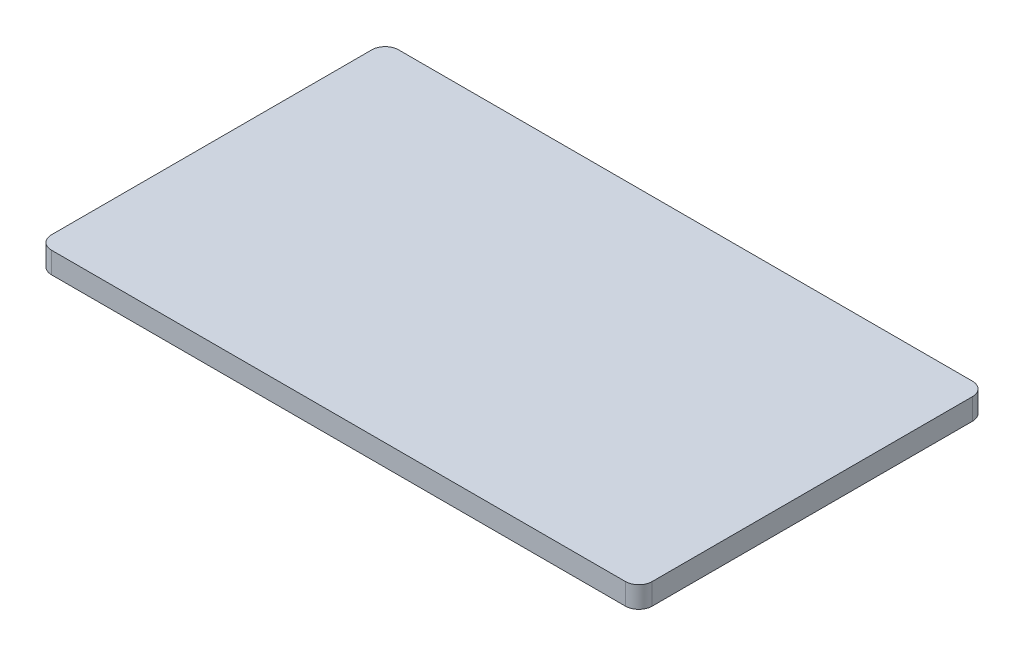
ISO-10303-21;
HEADER;
FILE_DESCRIPTION(('STEP AP214'),'2;1');
FILE_NAME('part.step','',(''),(''),'','','');
FILE_SCHEMA(('AUTOMOTIVE_DESIGN { 1 0 10303 214 1 1 1 1 }'));
ENDSEC;
DATA;
#1=APPLICATION_CONTEXT('core data for automotive mechanical design processes');
#2=APPLICATION_PROTOCOL_DEFINITION('international standard','automotive_design',2000,#1);
#3=PRODUCT_CONTEXT('',#1,'mechanical');
#4=PRODUCT('Part','Part','',(#3));
#5=PRODUCT_RELATED_PRODUCT_CATEGORY('part','',(#4));
#6=PRODUCT_DEFINITION_FORMATION('','',#4);
#7=PRODUCT_DEFINITION_CONTEXT('part definition',#1,'design');
#8=PRODUCT_DEFINITION('design','',#6,#7);
#9=PRODUCT_DEFINITION_SHAPE('','',#8);
#10=(LENGTH_UNIT() NAMED_UNIT(*) SI_UNIT(.MILLI.,.METRE.));
#11=(NAMED_UNIT(*) PLANE_ANGLE_UNIT() SI_UNIT($,.RADIAN.));
#12=(NAMED_UNIT(*) SI_UNIT($,.STERADIAN.) SOLID_ANGLE_UNIT());
#13=UNCERTAINTY_MEASURE_WITH_UNIT(LENGTH_MEASURE(1.E-05),#10,'distance_accuracy_value','');
#14=(GEOMETRIC_REPRESENTATION_CONTEXT(3) GLOBAL_UNCERTAINTY_ASSIGNED_CONTEXT((#13)) GLOBAL_UNIT_ASSIGNED_CONTEXT((#10,
#11,#12)) REPRESENTATION_CONTEXT('',''));
#15=CARTESIAN_POINT('',(0.,0.,0.));
#16=DIRECTION('',(0.,0.,1.));
#17=DIRECTION('',(1.,0.,0.));
#18=AXIS2_PLACEMENT_3D('',#15,#16,#17);
#19=CARTESIAN_POINT('',(22.5,1.6,13.));
#20=DIRECTION('',(-1.,0.,0.));
#21=DIRECTION('',(0.,0.,1.));
#22=AXIS2_PLACEMENT_3D('',#19,#20,#21);
#23=PLANE('',#22);
#24=DIRECTION('',(0.,0.,-1.));
#25=VECTOR('',#24,1.);
#26=CARTESIAN_POINT('',(22.5,1.6,13.));
#27=LINE('',#26,#25);
#28=CARTESIAN_POINT('',(22.5,1.6,12.));
#29=VERTEX_POINT('',#28);
#30=CARTESIAN_POINT('',(22.5,1.6,-12.));
#31=VERTEX_POINT('',#30);
#32=EDGE_CURVE('E119',#29,#31,#27,.T.);
#33=ORIENTED_EDGE('',*,*,#32,.F.);
#34=DIRECTION('',(0.,-1.,0.));
#35=VECTOR('',#34,1.);
#36=CARTESIAN_POINT('',(22.5,1.6,12.));
#37=LINE('',#36,#35);
#38=CARTESIAN_POINT('',(22.5,0.,12.));
#39=VERTEX_POINT('',#38);
#40=EDGE_CURVE('E104',#29,#39,#37,.T.);
#41=ORIENTED_EDGE('',*,*,#40,.T.);
#42=DIRECTION('',(0.,0.,-1.));
#43=VECTOR('',#42,1.);
#44=CARTESIAN_POINT('',(22.5,0.,13.));
#45=LINE('',#44,#43);
#46=CARTESIAN_POINT('',(22.5,0.,-12.));
#47=VERTEX_POINT('',#46);
#48=EDGE_CURVE('E116',#39,#47,#45,.T.);
#49=ORIENTED_EDGE('',*,*,#48,.T.);
#50=DIRECTION('',(0.,-1.,0.));
#51=VECTOR('',#50,1.);
#52=CARTESIAN_POINT('',(22.5,1.6,-12.));
#53=LINE('',#52,#51);
#54=EDGE_CURVE('E121',#47,#31,#53,.F.);
#55=ORIENTED_EDGE('',*,*,#54,.T.);
#56=EDGE_LOOP('',(#33,#41,#49,#55));
#57=FACE_BOUND('',#56,.T.);
#58=ADVANCED_FACE('F34',(#57),#23,.F.);
#59=CARTESIAN_POINT('',(-22.5,1.6,-13.));
#60=DIRECTION('',(0.,0.,1.));
#61=DIRECTION('',(1.,0.,0.));
#62=AXIS2_PLACEMENT_3D('',#59,#60,#61);
#63=PLANE('',#62);
#64=DIRECTION('',(-1.,0.,0.));
#65=VECTOR('',#64,1.);
#66=CARTESIAN_POINT('',(-22.5,1.6,-13.));
#67=LINE('',#66,#65);
#68=CARTESIAN_POINT('',(21.5,1.6,-13.));
#69=VERTEX_POINT('',#68);
#70=CARTESIAN_POINT('',(-21.5,1.6,-13.));
#71=VERTEX_POINT('',#70);
#72=EDGE_CURVE('E161',#69,#71,#67,.T.);
#73=ORIENTED_EDGE('',*,*,#72,.F.);
#74=DIRECTION('',(0.,-1.,0.));
#75=VECTOR('',#74,1.);
#76=CARTESIAN_POINT('',(21.5,1.6,-13.));
#77=LINE('',#76,#75);
#78=CARTESIAN_POINT('',(21.5,0.,-13.));
#79=VERTEX_POINT('',#78);
#80=EDGE_CURVE('E154',#69,#79,#77,.T.);
#81=ORIENTED_EDGE('',*,*,#80,.T.);
#82=DIRECTION('',(-1.,0.,0.));
#83=VECTOR('',#82,1.);
#84=CARTESIAN_POINT('',(-22.5,0.,-13.));
#85=LINE('',#84,#83);
#86=CARTESIAN_POINT('',(-21.5,0.,-13.));
#87=VERTEX_POINT('',#86);
#88=EDGE_CURVE('E125',#79,#87,#85,.T.);
#89=ORIENTED_EDGE('',*,*,#88,.T.);
#90=DIRECTION('',(0.,-1.,0.));
#91=VECTOR('',#90,1.);
#92=CARTESIAN_POINT('',(-21.5,1.6,-13.));
#93=LINE('',#92,#91);
#94=EDGE_CURVE('E152',#87,#71,#93,.F.);
#95=ORIENTED_EDGE('',*,*,#94,.T.);
#96=EDGE_LOOP('',(#73,#81,#89,#95));
#97=FACE_BOUND('',#96,.T.);
#98=ADVANCED_FACE('F159',(#97),#63,.F.);
#99=CARTESIAN_POINT('',(-22.5,1.6,13.));
#100=DIRECTION('',(1.,0.,0.));
#101=DIRECTION('',(0.,0.,-1.));
#102=AXIS2_PLACEMENT_3D('',#99,#100,#101);
#103=PLANE('',#102);
#104=DIRECTION('',(0.,0.,1.));
#105=VECTOR('',#104,1.);
#106=CARTESIAN_POINT('',(-22.5,1.6,13.));
#107=LINE('',#106,#105);
#108=CARTESIAN_POINT('',(-22.5,1.6,-12.));
#109=VERTEX_POINT('',#108);
#110=CARTESIAN_POINT('',(-22.5,1.6,12.));
#111=VERTEX_POINT('',#110);
#112=EDGE_CURVE('E169',#109,#111,#107,.T.);
#113=ORIENTED_EDGE('',*,*,#112,.F.);
#114=DIRECTION('',(0.,-1.,0.));
#115=VECTOR('',#114,1.);
#116=CARTESIAN_POINT('',(-22.5,1.6,-12.));
#117=LINE('',#116,#115);
#118=CARTESIAN_POINT('',(-22.5,0.,-12.));
#119=VERTEX_POINT('',#118);
#120=EDGE_CURVE('E11',#109,#119,#117,.T.);
#121=ORIENTED_EDGE('',*,*,#120,.T.);
#122=DIRECTION('',(0.,0.,1.));
#123=VECTOR('',#122,1.);
#124=CARTESIAN_POINT('',(-22.5,0.,13.));
#125=LINE('',#124,#123);
#126=CARTESIAN_POINT('',(-22.5,0.,12.));
#127=VERTEX_POINT('',#126);
#128=EDGE_CURVE('E128',#119,#127,#125,.T.);
#129=ORIENTED_EDGE('',*,*,#128,.T.);
#130=DIRECTION('',(0.,-1.,0.));
#131=VECTOR('',#130,1.);
#132=CARTESIAN_POINT('',(-22.5,1.6,12.));
#133=LINE('',#132,#131);
#134=EDGE_CURVE('E42',#127,#111,#133,.F.);
#135=ORIENTED_EDGE('',*,*,#134,.T.);
#136=EDGE_LOOP('',(#113,#121,#129,#135));
#137=FACE_BOUND('',#136,.T.);
#138=ADVANCED_FACE('F168',(#137),#103,.F.);
#139=CARTESIAN_POINT('',(-22.5,1.6,13.));
#140=DIRECTION('',(0.,0.,-1.));
#141=DIRECTION('',(-1.,0.,0.));
#142=AXIS2_PLACEMENT_3D('',#139,#140,#141);
#143=PLANE('',#142);
#144=DIRECTION('',(1.,0.,0.));
#145=VECTOR('',#144,1.);
#146=CARTESIAN_POINT('',(-22.5,0.,13.));
#147=LINE('',#146,#145);
#148=CARTESIAN_POINT('',(-21.5,0.,13.));
#149=VERTEX_POINT('',#148);
#150=CARTESIAN_POINT('',(21.5,0.,13.));
#151=VERTEX_POINT('',#150);
#152=EDGE_CURVE('E135',#149,#151,#147,.T.);
#153=ORIENTED_EDGE('',*,*,#152,.T.);
#154=DIRECTION('',(0.,-1.,0.));
#155=VECTOR('',#154,1.);
#156=CARTESIAN_POINT('',(21.5,1.6,13.));
#157=LINE('',#156,#155);
#158=CARTESIAN_POINT('',(21.5,1.6,13.));
#159=VERTEX_POINT('',#158);
#160=EDGE_CURVE('E105',#151,#159,#157,.F.);
#161=ORIENTED_EDGE('',*,*,#160,.T.);
#162=DIRECTION('',(1.,0.,0.));
#163=VECTOR('',#162,1.);
#164=CARTESIAN_POINT('',(-22.5,1.6,13.));
#165=LINE('',#164,#163);
#166=CARTESIAN_POINT('',(-21.5,1.6,13.));
#167=VERTEX_POINT('',#166);
#168=EDGE_CURVE('E131',#167,#159,#165,.T.);
#169=ORIENTED_EDGE('',*,*,#168,.F.);
#170=DIRECTION('',(0.,-1.,0.));
#171=VECTOR('',#170,1.);
#172=CARTESIAN_POINT('',(-21.5,1.6,13.));
#173=LINE('',#172,#171);
#174=EDGE_CURVE('E110',#167,#149,#173,.T.);
#175=ORIENTED_EDGE('',*,*,#174,.T.);
#176=EDGE_LOOP('',(#153,#161,#169,#175));
#177=FACE_BOUND('',#176,.T.);
#178=ADVANCED_FACE('F192',(#177),#143,.F.);
#179=CARTESIAN_POINT('',(0.,1.6,0.));
#180=DIRECTION('',(0.,-1.,0.));
#181=DIRECTION('',(0.,0.,-1.));
#182=AXIS2_PLACEMENT_3D('',#179,#180,#181);
#183=PLANE('',#182);
#184=ORIENTED_EDGE('',*,*,#168,.T.);
#185=CARTESIAN_POINT('',(21.5,1.6,12.));
#186=DIRECTION('',(0.,-1.,0.));
#187=DIRECTION('',(0.,0.,-1.));
#188=AXIS2_PLACEMENT_3D('',#185,#186,#187);
#189=CIRCLE('',#188,1.);
#190=EDGE_CURVE('E150',#159,#29,#189,.F.);
#191=ORIENTED_EDGE('',*,*,#190,.T.);
#192=ORIENTED_EDGE('',*,*,#32,.T.);
#193=CARTESIAN_POINT('',(21.5,1.6,-12.));
#194=DIRECTION('',(0.,-1.,0.));
#195=DIRECTION('',(0.,0.,-1.));
#196=AXIS2_PLACEMENT_3D('',#193,#194,#195);
#197=CIRCLE('',#196,1.);
#198=EDGE_CURVE('E148',#31,#69,#197,.F.);
#199=ORIENTED_EDGE('',*,*,#198,.T.);
#200=ORIENTED_EDGE('',*,*,#72,.T.);
#201=CARTESIAN_POINT('',(-21.5,1.6,-12.));
#202=DIRECTION('',(0.,-1.,0.));
#203=DIRECTION('',(0.,0.,-1.));
#204=AXIS2_PLACEMENT_3D('',#201,#202,#203);
#205=CIRCLE('',#204,1.);
#206=EDGE_CURVE('E55',#71,#109,#205,.F.);
#207=ORIENTED_EDGE('',*,*,#206,.T.);
#208=ORIENTED_EDGE('',*,*,#112,.T.);
#209=CARTESIAN_POINT('',(-21.5,1.6,12.));
#210=DIRECTION('',(0.,-1.,0.));
#211=DIRECTION('',(0.,0.,-1.));
#212=AXIS2_PLACEMENT_3D('',#209,#210,#211);
#213=CIRCLE('',#212,1.);
#214=EDGE_CURVE('E145',#111,#167,#213,.F.);
#215=ORIENTED_EDGE('',*,*,#214,.T.);
#216=EDGE_LOOP('',(#184,#191,#192,#199,#200,#207,#208,#215));
#217=FACE_BOUND('',#216,.T.);
#218=ADVANCED_FACE('F174',(#217),#183,.F.);
#219=CARTESIAN_POINT('',(0.,0.,0.));
#220=DIRECTION('',(0.,-1.,0.));
#221=DIRECTION('',(0.,0.,-1.));
#222=AXIS2_PLACEMENT_3D('',#219,#220,#221);
#223=PLANE('',#222);
#224=ORIENTED_EDGE('',*,*,#48,.F.);
#225=CARTESIAN_POINT('',(21.5,0.,12.));
#226=DIRECTION('',(0.,-1.,0.));
#227=DIRECTION('',(0.,0.,-1.));
#228=AXIS2_PLACEMENT_3D('',#225,#226,#227);
#229=CIRCLE('',#228,1.);
#230=EDGE_CURVE('E100',#39,#151,#229,.T.);
#231=ORIENTED_EDGE('',*,*,#230,.T.);
#232=ORIENTED_EDGE('',*,*,#152,.F.);
#233=CARTESIAN_POINT('',(-21.5,0.,12.));
#234=DIRECTION('',(0.,-1.,0.));
#235=DIRECTION('',(0.,0.,-1.));
#236=AXIS2_PLACEMENT_3D('',#233,#234,#235);
#237=CIRCLE('',#236,1.);
#238=EDGE_CURVE('E120',#149,#127,#237,.T.);
#239=ORIENTED_EDGE('',*,*,#238,.T.);
#240=ORIENTED_EDGE('',*,*,#128,.F.);
#241=CARTESIAN_POINT('',(-21.5,0.,-12.));
#242=DIRECTION('',(0.,-1.,0.));
#243=DIRECTION('',(0.,0.,-1.));
#244=AXIS2_PLACEMENT_3D('',#241,#242,#243);
#245=CIRCLE('',#244,1.);
#246=EDGE_CURVE('E139',#119,#87,#245,.T.);
#247=ORIENTED_EDGE('',*,*,#246,.T.);
#248=ORIENTED_EDGE('',*,*,#88,.F.);
#249=CARTESIAN_POINT('',(21.5,0.,-12.));
#250=DIRECTION('',(0.,-1.,0.));
#251=DIRECTION('',(0.,0.,-1.));
#252=AXIS2_PLACEMENT_3D('',#249,#250,#251);
#253=CIRCLE('',#252,1.);
#254=EDGE_CURVE('E111',#79,#47,#253,.T.);
#255=ORIENTED_EDGE('',*,*,#254,.T.);
#256=EDGE_LOOP('',(#224,#231,#232,#239,#240,#247,#248,#255));
#257=FACE_BOUND('',#256,.T.);
#258=ADVANCED_FACE('F123',(#257),#223,.T.);
#259=CARTESIAN_POINT('',(21.5,1.6,12.));
#260=DIRECTION('',(0.,-1.,0.));
#261=DIRECTION('',(0.,0.,-1.));
#262=AXIS2_PLACEMENT_3D('',#259,#260,#261);
#263=CYLINDRICAL_SURFACE('',#262,1.);
#264=ORIENTED_EDGE('',*,*,#190,.F.);
#265=ORIENTED_EDGE('',*,*,#160,.F.);
#266=ORIENTED_EDGE('',*,*,#230,.F.);
#267=ORIENTED_EDGE('',*,*,#40,.F.);
#268=EDGE_LOOP('',(#264,#265,#266,#267));
#269=FACE_BOUND('',#268,.T.);
#270=ADVANCED_FACE('F103',(#269),#263,.T.);
#271=CARTESIAN_POINT('',(21.5,1.6,-12.));
#272=DIRECTION('',(0.,-1.,0.));
#273=DIRECTION('',(0.,0.,-1.));
#274=AXIS2_PLACEMENT_3D('',#271,#272,#273);
#275=CYLINDRICAL_SURFACE('',#274,1.);
#276=ORIENTED_EDGE('',*,*,#198,.F.);
#277=ORIENTED_EDGE('',*,*,#54,.F.);
#278=ORIENTED_EDGE('',*,*,#254,.F.);
#279=ORIENTED_EDGE('',*,*,#80,.F.);
#280=EDGE_LOOP('',(#276,#277,#278,#279));
#281=FACE_BOUND('',#280,.T.);
#282=ADVANCED_FACE('F175',(#281),#275,.T.);
#283=CARTESIAN_POINT('',(-21.5,1.6,-12.));
#284=DIRECTION('',(0.,-1.,0.));
#285=DIRECTION('',(0.,0.,-1.));
#286=AXIS2_PLACEMENT_3D('',#283,#284,#285);
#287=CYLINDRICAL_SURFACE('',#286,1.);
#288=ORIENTED_EDGE('',*,*,#206,.F.);
#289=ORIENTED_EDGE('',*,*,#94,.F.);
#290=ORIENTED_EDGE('',*,*,#246,.F.);
#291=ORIENTED_EDGE('',*,*,#120,.F.);
#292=EDGE_LOOP('',(#288,#289,#290,#291));
#293=FACE_BOUND('',#292,.T.);
#294=ADVANCED_FACE('F167',(#293),#287,.T.);
#295=CARTESIAN_POINT('',(-21.5,1.6,12.));
#296=DIRECTION('',(0.,-1.,0.));
#297=DIRECTION('',(0.,0.,-1.));
#298=AXIS2_PLACEMENT_3D('',#295,#296,#297);
#299=CYLINDRICAL_SURFACE('',#298,1.);
#300=ORIENTED_EDGE('',*,*,#214,.F.);
#301=ORIENTED_EDGE('',*,*,#134,.F.);
#302=ORIENTED_EDGE('',*,*,#238,.F.);
#303=ORIENTED_EDGE('',*,*,#174,.F.);
#304=EDGE_LOOP('',(#300,#301,#302,#303));
#305=FACE_BOUND('',#304,.T.);
#306=ADVANCED_FACE('F36',(#305),#299,.T.);
#307=CLOSED_SHELL('',(#58,#98,#138,#178,#218,#258,#270,#282,#294,#306));
#308=MANIFOLD_SOLID_BREP('B2',#307);
#309=ADVANCED_BREP_SHAPE_REPRESENTATION('',(#18,#308),#14);
#310=SHAPE_DEFINITION_REPRESENTATION(#9,#309);
ENDSEC;
END-ISO-10303-21;
